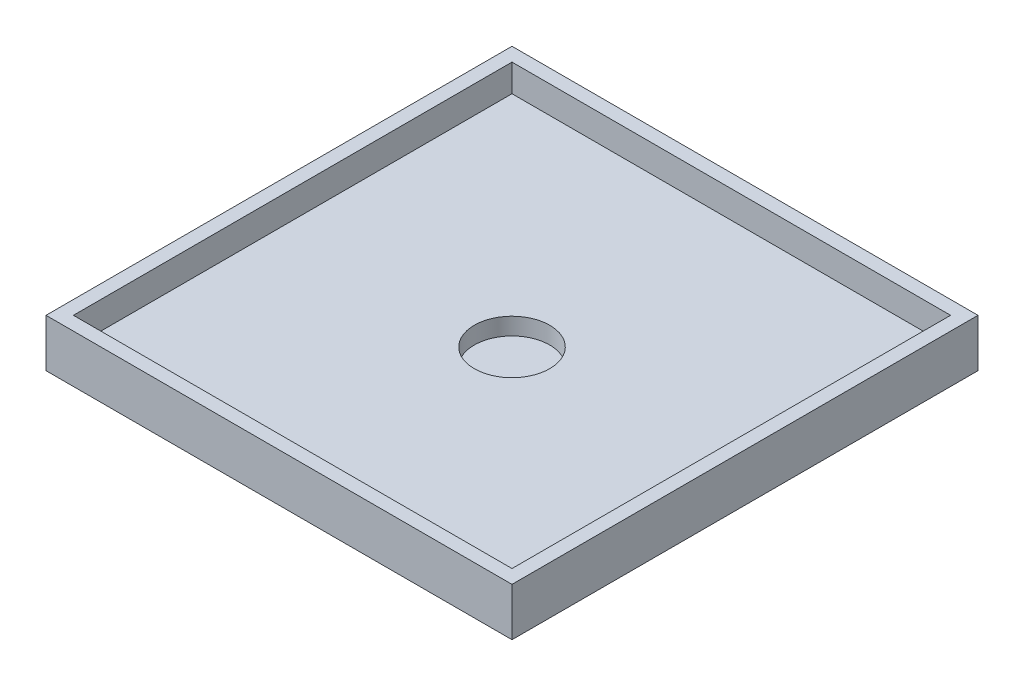
ISO-10303-21;
HEADER;
FILE_DESCRIPTION(('STEP AP214'),'2;1');
FILE_NAME('part.step','',(''),(''),'','','');
FILE_SCHEMA(('AUTOMOTIVE_DESIGN { 1 0 10303 214 1 1 1 1 }'));
ENDSEC;
DATA;
#1=APPLICATION_CONTEXT('core data for automotive mechanical design processes');
#2=APPLICATION_PROTOCOL_DEFINITION('international standard','automotive_design',2000,#1);
#3=PRODUCT_CONTEXT('',#1,'mechanical');
#4=PRODUCT('Part','Part','',(#3));
#5=PRODUCT_RELATED_PRODUCT_CATEGORY('part','',(#4));
#6=PRODUCT_DEFINITION_FORMATION('','',#4);
#7=PRODUCT_DEFINITION_CONTEXT('part definition',#1,'design');
#8=PRODUCT_DEFINITION('design','',#6,#7);
#9=PRODUCT_DEFINITION_SHAPE('','',#8);
#10=(LENGTH_UNIT() NAMED_UNIT(*) SI_UNIT(.MILLI.,.METRE.));
#11=(NAMED_UNIT(*) PLANE_ANGLE_UNIT() SI_UNIT($,.RADIAN.));
#12=(NAMED_UNIT(*) SI_UNIT($,.STERADIAN.) SOLID_ANGLE_UNIT());
#13=UNCERTAINTY_MEASURE_WITH_UNIT(LENGTH_MEASURE(1.E-05),#10,'distance_accuracy_value','');
#14=(GEOMETRIC_REPRESENTATION_CONTEXT(3) GLOBAL_UNCERTAINTY_ASSIGNED_CONTEXT((#13)) GLOBAL_UNIT_ASSIGNED_CONTEXT((#10,
#11,#12)) REPRESENTATION_CONTEXT('',''));
#15=CARTESIAN_POINT('',(0.,0.,0.));
#16=DIRECTION('',(0.,0.,1.));
#17=DIRECTION('',(1.,0.,0.));
#18=AXIS2_PLACEMENT_3D('',#15,#16,#17);
#19=CARTESIAN_POINT('',(34.,7.,34.));
#20=DIRECTION('',(-1.,0.,0.));
#21=DIRECTION('',(0.,0.,1.));
#22=AXIS2_PLACEMENT_3D('',#19,#20,#21);
#23=PLANE('',#22);
#24=DIRECTION('',(0.,0.,-1.));
#25=VECTOR('',#24,1.);
#26=CARTESIAN_POINT('',(34.,0.,34.));
#27=LINE('',#26,#25);
#28=CARTESIAN_POINT('',(34.,0.,34.));
#29=VERTEX_POINT('',#28);
#30=CARTESIAN_POINT('',(34.,0.,-34.));
#31=VERTEX_POINT('',#30);
#32=EDGE_CURVE('E147',#29,#31,#27,.T.);
#33=ORIENTED_EDGE('',*,*,#32,.T.);
#34=DIRECTION('',(0.,-1.,0.));
#35=VECTOR('',#34,1.);
#36=CARTESIAN_POINT('',(34.,7.,-34.));
#37=LINE('',#36,#35);
#38=CARTESIAN_POINT('',(34.,7.,-34.));
#39=VERTEX_POINT('',#38);
#40=EDGE_CURVE('E11',#39,#31,#37,.T.);
#41=ORIENTED_EDGE('',*,*,#40,.F.);
#42=DIRECTION('',(0.,0.,-1.));
#43=VECTOR('',#42,1.);
#44=CARTESIAN_POINT('',(34.,7.,34.));
#45=LINE('',#44,#43);
#46=CARTESIAN_POINT('',(34.,7.,34.));
#47=VERTEX_POINT('',#46);
#48=EDGE_CURVE('E151',#47,#39,#45,.T.);
#49=ORIENTED_EDGE('',*,*,#48,.F.);
#50=DIRECTION('',(0.,-1.,0.));
#51=VECTOR('',#50,1.);
#52=CARTESIAN_POINT('',(34.,7.,34.));
#53=LINE('',#52,#51);
#54=EDGE_CURVE('E157',#47,#29,#53,.T.);
#55=ORIENTED_EDGE('',*,*,#54,.T.);
#56=EDGE_LOOP('',(#33,#41,#49,#55));
#57=FACE_BOUND('',#56,.T.);
#58=ADVANCED_FACE('F35',(#57),#23,.F.);
#59=CARTESIAN_POINT('',(-34.,7.,-34.));
#60=DIRECTION('',(0.,0.,1.));
#61=DIRECTION('',(1.,0.,0.));
#62=AXIS2_PLACEMENT_3D('',#59,#60,#61);
#63=PLANE('',#62);
#64=DIRECTION('',(-1.,0.,0.));
#65=VECTOR('',#64,1.);
#66=CARTESIAN_POINT('',(-34.,0.,-34.));
#67=LINE('',#66,#65);
#68=CARTESIAN_POINT('',(-34.,0.,-34.));
#69=VERTEX_POINT('',#68);
#70=EDGE_CURVE('E160',#31,#69,#67,.T.);
#71=ORIENTED_EDGE('',*,*,#70,.T.);
#72=DIRECTION('',(0.,-1.,0.));
#73=VECTOR('',#72,1.);
#74=CARTESIAN_POINT('',(-34.,7.,-34.));
#75=LINE('',#74,#73);
#76=CARTESIAN_POINT('',(-34.,7.,-34.));
#77=VERTEX_POINT('',#76);
#78=EDGE_CURVE('E42',#77,#69,#75,.T.);
#79=ORIENTED_EDGE('',*,*,#78,.F.);
#80=DIRECTION('',(-1.,0.,0.));
#81=VECTOR('',#80,1.);
#82=CARTESIAN_POINT('',(-34.,7.,-34.));
#83=LINE('',#82,#81);
#84=EDGE_CURVE('E86',#39,#77,#83,.T.);
#85=ORIENTED_EDGE('',*,*,#84,.F.);
#86=ORIENTED_EDGE('',*,*,#40,.T.);
#87=EDGE_LOOP('',(#71,#79,#85,#86));
#88=FACE_BOUND('',#87,.T.);
#89=ADVANCED_FACE('F189',(#88),#63,.F.);
#90=CARTESIAN_POINT('',(-34.,7.,34.));
#91=DIRECTION('',(1.,0.,0.));
#92=DIRECTION('',(0.,0.,-1.));
#93=AXIS2_PLACEMENT_3D('',#90,#91,#92);
#94=PLANE('',#93);
#95=DIRECTION('',(0.,0.,1.));
#96=VECTOR('',#95,1.);
#97=CARTESIAN_POINT('',(-34.,0.,34.));
#98=LINE('',#97,#96);
#99=CARTESIAN_POINT('',(-34.,0.,34.));
#100=VERTEX_POINT('',#99);
#101=EDGE_CURVE('E162',#69,#100,#98,.T.);
#102=ORIENTED_EDGE('',*,*,#101,.T.);
#103=DIRECTION('',(0.,-1.,0.));
#104=VECTOR('',#103,1.);
#105=CARTESIAN_POINT('',(-34.,7.,34.));
#106=LINE('',#105,#104);
#107=CARTESIAN_POINT('',(-34.,7.,34.));
#108=VERTEX_POINT('',#107);
#109=EDGE_CURVE('E166',#108,#100,#106,.T.);
#110=ORIENTED_EDGE('',*,*,#109,.F.);
#111=DIRECTION('',(0.,0.,1.));
#112=VECTOR('',#111,1.);
#113=CARTESIAN_POINT('',(-34.,7.,34.));
#114=LINE('',#113,#112);
#115=EDGE_CURVE('E154',#77,#108,#114,.T.);
#116=ORIENTED_EDGE('',*,*,#115,.F.);
#117=ORIENTED_EDGE('',*,*,#78,.T.);
#118=EDGE_LOOP('',(#102,#110,#116,#117));
#119=FACE_BOUND('',#118,.T.);
#120=ADVANCED_FACE('F171',(#119),#94,.F.);
#121=CARTESIAN_POINT('',(-34.,7.,34.));
#122=DIRECTION('',(0.,0.,-1.));
#123=DIRECTION('',(-1.,0.,0.));
#124=AXIS2_PLACEMENT_3D('',#121,#122,#123);
#125=PLANE('',#124);
#126=DIRECTION('',(1.,0.,0.));
#127=VECTOR('',#126,1.);
#128=CARTESIAN_POINT('',(-34.,0.,34.));
#129=LINE('',#128,#127);
#130=EDGE_CURVE('E79',#100,#29,#129,.T.);
#131=ORIENTED_EDGE('',*,*,#130,.T.);
#132=ORIENTED_EDGE('',*,*,#54,.F.);
#133=DIRECTION('',(1.,0.,0.));
#134=VECTOR('',#133,1.);
#135=CARTESIAN_POINT('',(-34.,7.,34.));
#136=LINE('',#135,#134);
#137=EDGE_CURVE('E58',#108,#47,#136,.T.);
#138=ORIENTED_EDGE('',*,*,#137,.F.);
#139=ORIENTED_EDGE('',*,*,#109,.T.);
#140=EDGE_LOOP('',(#131,#132,#138,#139));
#141=FACE_BOUND('',#140,.T.);
#142=ADVANCED_FACE('F179',(#141),#125,.F.);
#143=CARTESIAN_POINT('',(0.,7.,0.));
#144=DIRECTION('',(0.,-1.,0.));
#145=DIRECTION('',(0.,0.,-1.));
#146=AXIS2_PLACEMENT_3D('',#143,#144,#145);
#147=PLANE('',#146);
#148=DIRECTION('',(-1.,0.,0.));
#149=VECTOR('',#148,1.);
#150=CARTESIAN_POINT('',(-32.,7.,-32.));
#151=LINE('',#150,#149);
#152=CARTESIAN_POINT('',(32.,7.,-32.));
#153=VERTEX_POINT('',#152);
#154=CARTESIAN_POINT('',(-32.,7.,-32.));
#155=VERTEX_POINT('',#154);
#156=EDGE_CURVE('E140',#153,#155,#151,.T.);
#157=ORIENTED_EDGE('',*,*,#156,.F.);
#158=DIRECTION('',(0.,0.,-1.));
#159=VECTOR('',#158,1.);
#160=CARTESIAN_POINT('',(32.,7.,32.));
#161=LINE('',#160,#159);
#162=CARTESIAN_POINT('',(32.,7.,32.));
#163=VERTEX_POINT('',#162);
#164=EDGE_CURVE('E49',#163,#153,#161,.T.);
#165=ORIENTED_EDGE('',*,*,#164,.F.);
#166=DIRECTION('',(1.,0.,0.));
#167=VECTOR('',#166,1.);
#168=CARTESIAN_POINT('',(-32.,7.,32.));
#169=LINE('',#168,#167);
#170=CARTESIAN_POINT('',(-32.,7.,32.));
#171=VERTEX_POINT('',#170);
#172=EDGE_CURVE('E128',#171,#163,#169,.T.);
#173=ORIENTED_EDGE('',*,*,#172,.F.);
#174=DIRECTION('',(0.,0.,1.));
#175=VECTOR('',#174,1.);
#176=CARTESIAN_POINT('',(-32.,7.,32.));
#177=LINE('',#176,#175);
#178=EDGE_CURVE('E131',#155,#171,#177,.T.);
#179=ORIENTED_EDGE('',*,*,#178,.F.);
#180=EDGE_LOOP('',(#157,#165,#173,#179));
#181=FACE_BOUND('',#180,.T.);
#182=ORIENTED_EDGE('',*,*,#48,.T.);
#183=ORIENTED_EDGE('',*,*,#84,.T.);
#184=ORIENTED_EDGE('',*,*,#115,.T.);
#185=ORIENTED_EDGE('',*,*,#137,.T.);
#186=EDGE_LOOP('',(#182,#183,#184,#185));
#187=FACE_BOUND('',#186,.T.);
#188=ADVANCED_FACE('F181',(#181,#187),#147,.F.);
#189=CARTESIAN_POINT('',(0.,0.,0.));
#190=DIRECTION('',(0.,-1.,0.));
#191=DIRECTION('',(0.,0.,-1.));
#192=AXIS2_PLACEMENT_3D('',#189,#190,#191);
#193=PLANE('',#192);
#194=ORIENTED_EDGE('',*,*,#32,.F.);
#195=ORIENTED_EDGE('',*,*,#130,.F.);
#196=ORIENTED_EDGE('',*,*,#101,.F.);
#197=ORIENTED_EDGE('',*,*,#70,.F.);
#198=EDGE_LOOP('',(#194,#195,#196,#197));
#199=FACE_BOUND('',#198,.T.);
#200=ADVANCED_FACE('F175',(#199),#193,.T.);
#201=CARTESIAN_POINT('',(32.,3.,32.));
#202=DIRECTION('',(1.,0.,0.));
#203=DIRECTION('',(0.,0.,-1.));
#204=AXIS2_PLACEMENT_3D('',#201,#202,#203);
#205=PLANE('',#204);
#206=ORIENTED_EDGE('',*,*,#164,.T.);
#207=DIRECTION('',(0.,1.,0.));
#208=VECTOR('',#207,1.);
#209=CARTESIAN_POINT('',(32.,3.,-32.));
#210=LINE('',#209,#208);
#211=CARTESIAN_POINT('',(32.,3.,-32.));
#212=VERTEX_POINT('',#211);
#213=EDGE_CURVE('E106',#212,#153,#210,.T.);
#214=ORIENTED_EDGE('',*,*,#213,.F.);
#215=DIRECTION('',(0.,0.,-1.));
#216=VECTOR('',#215,1.);
#217=CARTESIAN_POINT('',(32.,3.,32.));
#218=LINE('',#217,#216);
#219=CARTESIAN_POINT('',(32.,3.,32.));
#220=VERTEX_POINT('',#219);
#221=EDGE_CURVE('E110',#220,#212,#218,.T.);
#222=ORIENTED_EDGE('',*,*,#221,.F.);
#223=DIRECTION('',(0.,1.,0.));
#224=VECTOR('',#223,1.);
#225=CARTESIAN_POINT('',(32.,3.,32.));
#226=LINE('',#225,#224);
#227=EDGE_CURVE('E145',#220,#163,#226,.T.);
#228=ORIENTED_EDGE('',*,*,#227,.T.);
#229=EDGE_LOOP('',(#206,#214,#222,#228));
#230=FACE_BOUND('',#229,.T.);
#231=ADVANCED_FACE('F108',(#230),#205,.F.);
#232=CARTESIAN_POINT('',(-32.,3.,32.));
#233=DIRECTION('',(0.,0.,1.));
#234=DIRECTION('',(1.,0.,0.));
#235=AXIS2_PLACEMENT_3D('',#232,#233,#234);
#236=PLANE('',#235);
#237=ORIENTED_EDGE('',*,*,#172,.T.);
#238=ORIENTED_EDGE('',*,*,#227,.F.);
#239=DIRECTION('',(1.,0.,0.));
#240=VECTOR('',#239,1.);
#241=CARTESIAN_POINT('',(-32.,3.,32.));
#242=LINE('',#241,#240);
#243=CARTESIAN_POINT('',(-32.,3.,32.));
#244=VERTEX_POINT('',#243);
#245=EDGE_CURVE('E116',#244,#220,#242,.T.);
#246=ORIENTED_EDGE('',*,*,#245,.F.);
#247=DIRECTION('',(0.,1.,0.));
#248=VECTOR('',#247,1.);
#249=CARTESIAN_POINT('',(-32.,3.,32.));
#250=LINE('',#249,#248);
#251=EDGE_CURVE('E148',#244,#171,#250,.T.);
#252=ORIENTED_EDGE('',*,*,#251,.T.);
#253=EDGE_LOOP('',(#237,#238,#246,#252));
#254=FACE_BOUND('',#253,.T.);
#255=ADVANCED_FACE('F228',(#254),#236,.F.);
#256=CARTESIAN_POINT('',(-32.,3.,32.));
#257=DIRECTION('',(-1.,0.,0.));
#258=DIRECTION('',(0.,0.,1.));
#259=AXIS2_PLACEMENT_3D('',#256,#257,#258);
#260=PLANE('',#259);
#261=ORIENTED_EDGE('',*,*,#178,.T.);
#262=ORIENTED_EDGE('',*,*,#251,.F.);
#263=DIRECTION('',(0.,0.,1.));
#264=VECTOR('',#263,1.);
#265=CARTESIAN_POINT('',(-32.,3.,32.));
#266=LINE('',#265,#264);
#267=CARTESIAN_POINT('',(-32.,3.,-32.));
#268=VERTEX_POINT('',#267);
#269=EDGE_CURVE('E124',#268,#244,#266,.T.);
#270=ORIENTED_EDGE('',*,*,#269,.F.);
#271=DIRECTION('',(0.,1.,0.));
#272=VECTOR('',#271,1.);
#273=CARTESIAN_POINT('',(-32.,3.,-32.));
#274=LINE('',#273,#272);
#275=EDGE_CURVE('E115',#268,#155,#274,.T.);
#276=ORIENTED_EDGE('',*,*,#275,.T.);
#277=EDGE_LOOP('',(#261,#262,#270,#276));
#278=FACE_BOUND('',#277,.T.);
#279=ADVANCED_FACE('F237',(#278),#260,.F.);
#280=CARTESIAN_POINT('',(-32.,3.,-32.));
#281=DIRECTION('',(0.,0.,-1.));
#282=DIRECTION('',(-1.,0.,0.));
#283=AXIS2_PLACEMENT_3D('',#280,#281,#282);
#284=PLANE('',#283);
#285=ORIENTED_EDGE('',*,*,#156,.T.);
#286=ORIENTED_EDGE('',*,*,#275,.F.);
#287=DIRECTION('',(-1.,0.,0.));
#288=VECTOR('',#287,1.);
#289=CARTESIAN_POINT('',(-32.,3.,-32.));
#290=LINE('',#289,#288);
#291=EDGE_CURVE('E119',#212,#268,#290,.T.);
#292=ORIENTED_EDGE('',*,*,#291,.F.);
#293=ORIENTED_EDGE('',*,*,#213,.T.);
#294=EDGE_LOOP('',(#285,#286,#292,#293));
#295=FACE_BOUND('',#294,.T.);
#296=ADVANCED_FACE('F120',(#295),#284,.F.);
#297=CARTESIAN_POINT('',(0.,3.,0.));
#298=DIRECTION('',(0.,-1.,0.));
#299=DIRECTION('',(0.,0.,-1.));
#300=AXIS2_PLACEMENT_3D('',#297,#298,#299);
#301=PLANE('',#300);
#302=CARTESIAN_POINT('',(0.,3.,0.));
#303=DIRECTION('',(0.,1.,0.));
#304=DIRECTION('',(0.,0.,1.));
#305=AXIS2_PLACEMENT_3D('',#302,#303,#304);
#306=CIRCLE('',#305,5.5);
#307=CARTESIAN_POINT('',(0.,3.,5.5));
#308=VERTEX_POINT('',#307);
#309=EDGE_CURVE('E134',#308,#308,#306,.T.);
#310=ORIENTED_EDGE('',*,*,#309,.F.);
#311=EDGE_LOOP('',(#310));
#312=FACE_BOUND('',#311,.T.);
#313=ORIENTED_EDGE('',*,*,#221,.T.);
#314=ORIENTED_EDGE('',*,*,#291,.T.);
#315=ORIENTED_EDGE('',*,*,#269,.T.);
#316=ORIENTED_EDGE('',*,*,#245,.T.);
#317=EDGE_LOOP('',(#313,#314,#315,#316));
#318=FACE_BOUND('',#317,.T.);
#319=ADVANCED_FACE('F126',(#312,#318),#301,.F.);
#320=CARTESIAN_POINT('',(0.,0.5,0.));
#321=DIRECTION('',(0.,1.,0.));
#322=DIRECTION('',(0.,0.,1.));
#323=AXIS2_PLACEMENT_3D('',#320,#321,#322);
#324=CYLINDRICAL_SURFACE('',#323,5.5);
#325=CARTESIAN_POINT('',(0.,0.5,0.));
#326=DIRECTION('',(0.,1.,0.));
#327=DIRECTION('',(0.,0.,1.));
#328=AXIS2_PLACEMENT_3D('',#325,#326,#327);
#329=CIRCLE('',#328,5.5);
#330=CARTESIAN_POINT('',(0.,0.5,5.5));
#331=VERTEX_POINT('',#330);
#332=EDGE_CURVE('E141',#331,#331,#329,.T.);
#333=ORIENTED_EDGE('',*,*,#332,.F.);
#334=EDGE_LOOP('',(#333));
#335=FACE_BOUND('',#334,.T.);
#336=ORIENTED_EDGE('',*,*,#309,.T.);
#337=EDGE_LOOP('',(#336));
#338=FACE_BOUND('',#337,.T.);
#339=ADVANCED_FACE('F264',(#335,#338),#324,.F.);
#340=CARTESIAN_POINT('',(0.,0.5,0.));
#341=DIRECTION('',(0.,1.,0.));
#342=DIRECTION('',(0.,0.,1.));
#343=AXIS2_PLACEMENT_3D('',#340,#341,#342);
#344=PLANE('',#343);
#345=ORIENTED_EDGE('',*,*,#332,.T.);
#346=EDGE_LOOP('',(#345));
#347=FACE_BOUND('',#346,.T.);
#348=ADVANCED_FACE('F274',(#347),#344,.T.);
#349=CLOSED_SHELL('',(#58,#89,#120,#142,#188,#200,#231,#255,#279,#296,#319,#339,#348));
#350=MANIFOLD_SOLID_BREP('B2',#349);
#351=ADVANCED_BREP_SHAPE_REPRESENTATION('',(#18,#350),#14);
#352=SHAPE_DEFINITION_REPRESENTATION(#9,#351);
ENDSEC;
END-ISO-10303-21;
